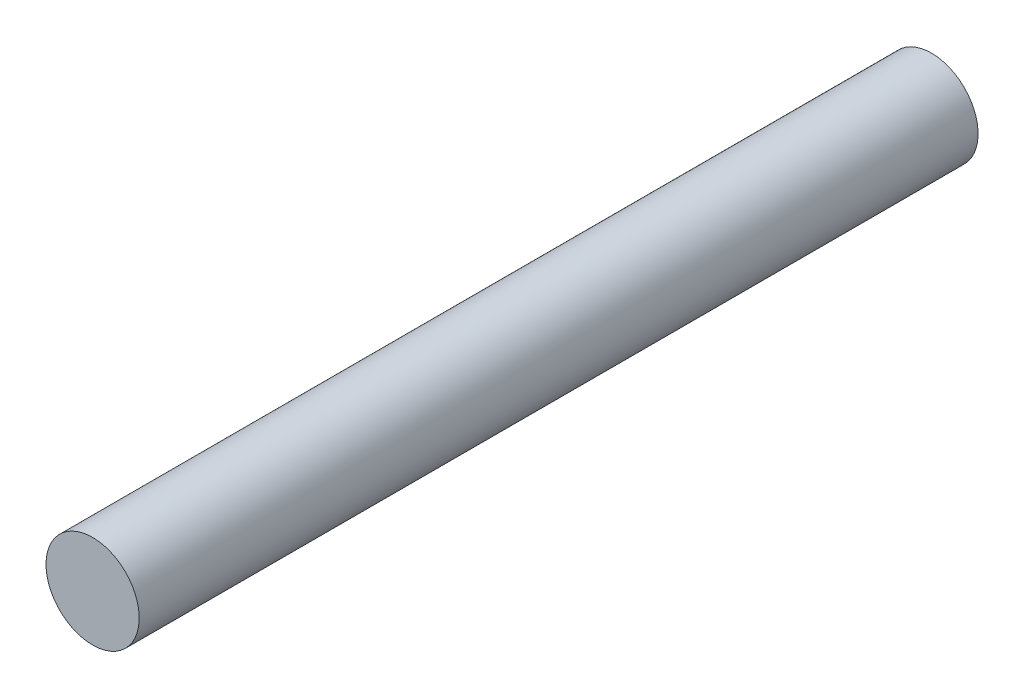
ISO-10303-21;
HEADER;
FILE_DESCRIPTION(('STEP AP214'),'2;1');
FILE_NAME('part.step','',(''),(''),'','','');
FILE_SCHEMA(('AUTOMOTIVE_DESIGN { 1 0 10303 214 1 1 1 1 }'));
ENDSEC;
DATA;
#1=APPLICATION_CONTEXT('core data for automotive mechanical design processes');
#2=APPLICATION_PROTOCOL_DEFINITION('international standard','automotive_design',2000,#1);
#3=PRODUCT_CONTEXT('',#1,'mechanical');
#4=PRODUCT('Part','Part','',(#3));
#5=PRODUCT_RELATED_PRODUCT_CATEGORY('part','',(#4));
#6=PRODUCT_DEFINITION_FORMATION('','',#4);
#7=PRODUCT_DEFINITION_CONTEXT('part definition',#1,'design');
#8=PRODUCT_DEFINITION('design','',#6,#7);
#9=PRODUCT_DEFINITION_SHAPE('','',#8);
#10=(LENGTH_UNIT() NAMED_UNIT(*) SI_UNIT(.MILLI.,.METRE.));
#11=(NAMED_UNIT(*) PLANE_ANGLE_UNIT() SI_UNIT($,.RADIAN.));
#12=(NAMED_UNIT(*) SI_UNIT($,.STERADIAN.) SOLID_ANGLE_UNIT());
#13=UNCERTAINTY_MEASURE_WITH_UNIT(LENGTH_MEASURE(1.E-05),#10,'distance_accuracy_value','');
#14=(GEOMETRIC_REPRESENTATION_CONTEXT(3) GLOBAL_UNCERTAINTY_ASSIGNED_CONTEXT((#13)) GLOBAL_UNIT_ASSIGNED_CONTEXT((#10,
#11,#12)) REPRESENTATION_CONTEXT('',''));
#15=CARTESIAN_POINT('',(0.,0.,0.));
#16=DIRECTION('',(0.,0.,1.));
#17=DIRECTION('',(1.,0.,0.));
#18=AXIS2_PLACEMENT_3D('',#15,#16,#17);
#19=CARTESIAN_POINT('',(0.,0.,90.));
#20=DIRECTION('',(0.,0.,-1.));
#21=DIRECTION('',(-1.,0.,0.));
#22=AXIS2_PLACEMENT_3D('',#19,#20,#21);
#23=CYLINDRICAL_SURFACE('',#22,5.);
#24=CARTESIAN_POINT('',(0.,0.,90.));
#25=DIRECTION('',(0.,0.,1.));
#26=DIRECTION('',(1.,0.,0.));
#27=AXIS2_PLACEMENT_3D('',#24,#25,#26);
#28=CIRCLE('',#27,5.);
#29=CARTESIAN_POINT('',(-5.,0.,90.));
#30=VERTEX_POINT('',#29);
#31=EDGE_CURVE('E10',#30,#30,#28,.T.);
#32=CARTESIAN_POINT('',(0.,0.,0.));
#33=DIRECTION('',(0.,0.,1.));
#34=DIRECTION('',(1.,0.,0.));
#35=AXIS2_PLACEMENT_3D('',#32,#33,#34);
#36=CIRCLE('',#35,5.);
#37=CARTESIAN_POINT('',(-5.,0.,0.));
#38=VERTEX_POINT('',#37);
#39=EDGE_CURVE('E36',#38,#38,#36,.T.);
#40=CARTESIAN_POINT('',(-5.,0.,90.));
#41=CARTESIAN_POINT('',(-5.,0.,89.0625));
#42=CARTESIAN_POINT('',(-5.,0.,88.125));
#43=CARTESIAN_POINT('',(-5.,0.,86.25));
#44=CARTESIAN_POINT('',(-5.,0.,85.3125));
#45=CARTESIAN_POINT('',(-5.,0.,83.4375));
#46=CARTESIAN_POINT('',(-5.,0.,82.5));
#47=CARTESIAN_POINT('',(-5.,0.,80.625));
#48=CARTESIAN_POINT('',(-5.,0.,79.6875));
#49=CARTESIAN_POINT('',(-5.,0.,77.8125));
#50=CARTESIAN_POINT('',(-5.,0.,76.875));
#51=CARTESIAN_POINT('',(-5.,0.,75.));
#52=CARTESIAN_POINT('',(-5.,0.,74.0625));
#53=CARTESIAN_POINT('',(-5.,0.,72.1875));
#54=CARTESIAN_POINT('',(-5.,0.,71.25));
#55=CARTESIAN_POINT('',(-5.,0.,69.375));
#56=CARTESIAN_POINT('',(-5.,0.,68.4375));
#57=CARTESIAN_POINT('',(-5.,0.,66.5625));
#58=CARTESIAN_POINT('',(-5.,0.,65.625));
#59=CARTESIAN_POINT('',(-5.,0.,63.75));
#60=CARTESIAN_POINT('',(-5.,0.,62.8125));
#61=CARTESIAN_POINT('',(-5.,0.,60.9375));
#62=CARTESIAN_POINT('',(-5.,0.,60.));
#63=CARTESIAN_POINT('',(-5.,0.,58.125));
#64=CARTESIAN_POINT('',(-5.,0.,57.1875));
#65=CARTESIAN_POINT('',(-5.,0.,55.3125));
#66=CARTESIAN_POINT('',(-5.,0.,54.375));
#67=CARTESIAN_POINT('',(-5.,0.,52.5));
#68=CARTESIAN_POINT('',(-5.,0.,51.5625));
#69=CARTESIAN_POINT('',(-5.,0.,49.6875));
#70=CARTESIAN_POINT('',(-5.,0.,48.75));
#71=CARTESIAN_POINT('',(-5.,0.,46.875));
#72=CARTESIAN_POINT('',(-5.,0.,45.9375));
#73=CARTESIAN_POINT('',(-5.,0.,44.0625));
#74=CARTESIAN_POINT('',(-5.,0.,43.125));
#75=CARTESIAN_POINT('',(-5.,0.,41.25));
#76=CARTESIAN_POINT('',(-5.,0.,40.3125));
#77=CARTESIAN_POINT('',(-5.,0.,38.4375));
#78=CARTESIAN_POINT('',(-5.,0.,37.5));
#79=CARTESIAN_POINT('',(-5.,0.,35.625));
#80=CARTESIAN_POINT('',(-5.,0.,34.6875));
#81=CARTESIAN_POINT('',(-5.,0.,32.8125));
#82=CARTESIAN_POINT('',(-5.,0.,31.875));
#83=CARTESIAN_POINT('',(-5.,0.,30.));
#84=CARTESIAN_POINT('',(-5.,0.,29.0625));
#85=CARTESIAN_POINT('',(-5.,0.,27.1875));
#86=CARTESIAN_POINT('',(-5.,0.,26.25));
#87=CARTESIAN_POINT('',(-5.,0.,24.375));
#88=CARTESIAN_POINT('',(-5.,0.,23.4375));
#89=CARTESIAN_POINT('',(-5.,0.,21.5625));
#90=CARTESIAN_POINT('',(-5.,0.,20.625));
#91=CARTESIAN_POINT('',(-5.,0.,18.75));
#92=CARTESIAN_POINT('',(-5.,0.,17.8125));
#93=CARTESIAN_POINT('',(-5.,0.,15.9375));
#94=CARTESIAN_POINT('',(-5.,0.,15.));
#95=CARTESIAN_POINT('',(-5.,0.,13.125));
#96=CARTESIAN_POINT('',(-5.,0.,12.1875));
#97=CARTESIAN_POINT('',(-5.,0.,10.3125));
#98=CARTESIAN_POINT('',(-5.,0.,9.37499999999999));
#99=CARTESIAN_POINT('',(-5.,0.,7.49999999999999));
#100=CARTESIAN_POINT('',(-5.,0.,6.56249999999999));
#101=CARTESIAN_POINT('',(-5.,0.,4.68749999999999));
#102=CARTESIAN_POINT('',(-5.,0.,3.74999999999998));
#103=CARTESIAN_POINT('',(-5.,0.,1.87499999999998));
#104=CARTESIAN_POINT('',(-5.,0.,0.937499999999986));
#105=CARTESIAN_POINT('',(-5.,0.,0.));
#106=B_SPLINE_CURVE_WITH_KNOTS('',3,(#40,#41,#42,#43,#44,#45,#46,#47,#48,#49,#50,#51,#52,#53,
#54,#55,#56,#57,#58,#59,#60,#61,#62,#63,#64,#65,#66,#67,#68,#69,#70,#71,#72,#73,#74,#75,#76,#77,
#78,#79,#80,#81,#82,#83,#84,#85,#86,#87,#88,#89,#90,#91,#92,#93,#94,#95,#96,#97,#98,#99,#100,
#101,#102,#103,#104,#105),.UNSPECIFIED.,.F.,.F.,(4,2,2,2,2,2,2,2,2,2,2,2,2,2,2,2,2,2,2,2,2,2,2,
2,2,2,2,2,2,2,2,2,4),(0.,2.8125,5.62499999999999,8.43749999999999,11.25,14.0625,16.875,19.6875,
22.5,25.3125,28.125,30.9375,33.75,36.5625,39.375,42.1875,45.,47.8125,50.625,53.4375,56.25,
59.0625,61.875,64.6875,67.5,70.3125,73.125,75.9375,78.75,81.5625,84.375,87.1875,90.),.UNSPECIFIED.);
#107=EDGE_CURVE('BSEAM33',#30,#38,#106,.T.);
#108=ORIENTED_EDGE('',*,*,#31,.F.);
#109=ORIENTED_EDGE('',*,*,#39,.T.);
#110=ORIENTED_EDGE('',*,*,#107,.T.);
#111=ORIENTED_EDGE('',*,*,#107,.F.);
#112=EDGE_LOOP('',(#108,#110,#109,#111));
#113=FACE_BOUND('',#112,.T.);
#114=ADVANCED_FACE('F33',(#113),#23,.T.);
#115=CARTESIAN_POINT('',(0.,0.,90.));
#116=DIRECTION('',(0.,0.,1.));
#117=DIRECTION('',(1.,0.,0.));
#118=AXIS2_PLACEMENT_3D('',#115,#116,#117);
#119=PLANE('',#118);
#120=ORIENTED_EDGE('',*,*,#31,.T.);
#121=EDGE_LOOP('',(#120));
#122=FACE_BOUND('',#121,.T.);
#123=ADVANCED_FACE('F48',(#122),#119,.T.);
#124=CARTESIAN_POINT('',(0.,0.,0.));
#125=DIRECTION('',(0.,0.,1.));
#126=DIRECTION('',(1.,0.,0.));
#127=AXIS2_PLACEMENT_3D('',#124,#125,#126);
#128=PLANE('',#127);
#129=ORIENTED_EDGE('',*,*,#39,.F.);
#130=EDGE_LOOP('',(#129));
#131=FACE_BOUND('',#130,.T.);
#132=ADVANCED_FACE('F46',(#131),#128,.F.);
#133=CLOSED_SHELL('',(#114,#123,#132));
#134=MANIFOLD_SOLID_BREP('B2',#133);
#135=ADVANCED_BREP_SHAPE_REPRESENTATION('',(#18,#134),#14);
#136=SHAPE_DEFINITION_REPRESENTATION(#9,#135);
ENDSEC;
END-ISO-10303-21;
